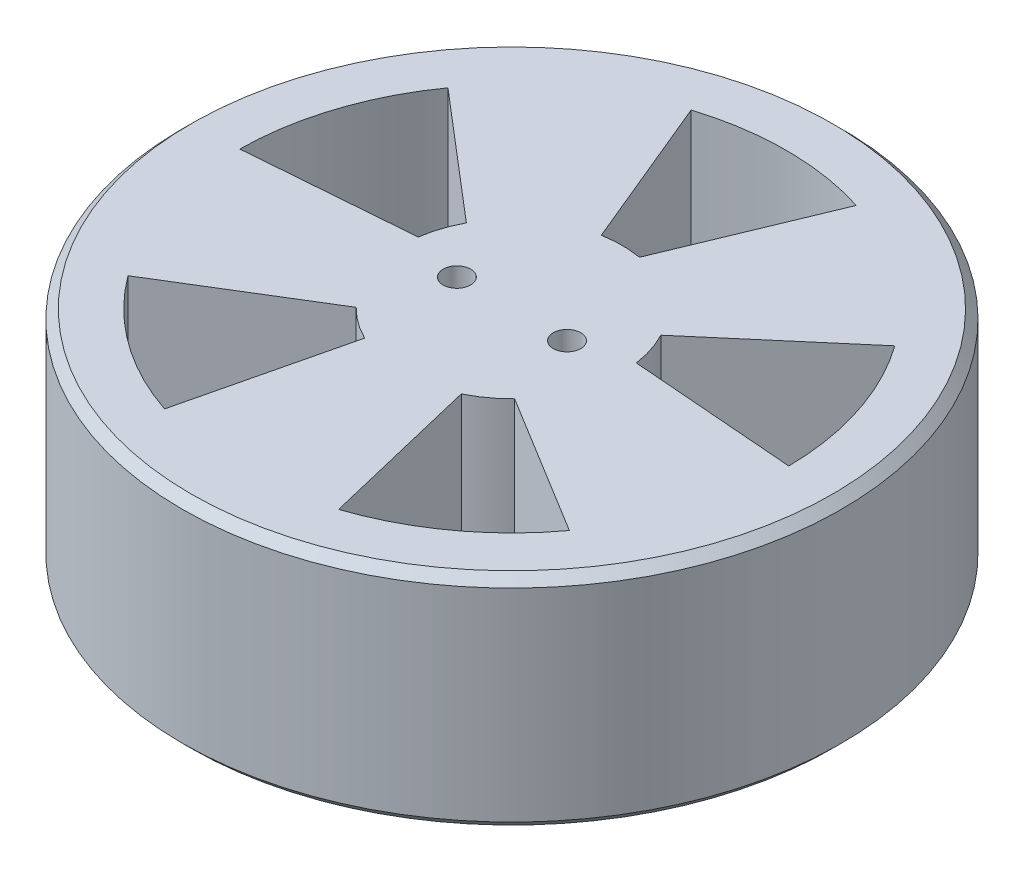
ISO-10303-21;
HEADER;
FILE_DESCRIPTION(('STEP AP214'),'2;1');
FILE_NAME('part.step','',(''),(''),'','','');
FILE_SCHEMA(('AUTOMOTIVE_DESIGN { 1 0 10303 214 1 1 1 1 }'));
ENDSEC;
DATA;
#1=APPLICATION_CONTEXT('core data for automotive mechanical design processes');
#2=APPLICATION_PROTOCOL_DEFINITION('international standard','automotive_design',2000,#1);
#3=PRODUCT_CONTEXT('',#1,'mechanical');
#4=PRODUCT('Part','Part','',(#3));
#5=PRODUCT_RELATED_PRODUCT_CATEGORY('part','',(#4));
#6=PRODUCT_DEFINITION_FORMATION('','',#4);
#7=PRODUCT_DEFINITION_CONTEXT('part definition',#1,'design');
#8=PRODUCT_DEFINITION('design','',#6,#7);
#9=PRODUCT_DEFINITION_SHAPE('','',#8);
#10=(LENGTH_UNIT() NAMED_UNIT(*) SI_UNIT(.MILLI.,.METRE.));
#11=(NAMED_UNIT(*) PLANE_ANGLE_UNIT() SI_UNIT($,.RADIAN.));
#12=(NAMED_UNIT(*) SI_UNIT($,.STERADIAN.) SOLID_ANGLE_UNIT());
#13=UNCERTAINTY_MEASURE_WITH_UNIT(LENGTH_MEASURE(1.E-05),#10,'distance_accuracy_value','');
#14=(GEOMETRIC_REPRESENTATION_CONTEXT(3) GLOBAL_UNCERTAINTY_ASSIGNED_CONTEXT((#13)) GLOBAL_UNIT_ASSIGNED_CONTEXT((#10,
#11,#12)) REPRESENTATION_CONTEXT('',''));
#15=CARTESIAN_POINT('',(0.,0.,0.));
#16=DIRECTION('',(0.,0.,1.));
#17=DIRECTION('',(1.,0.,0.));
#18=AXIS2_PLACEMENT_3D('',#15,#16,#17);
#19=CARTESIAN_POINT('',(0.,50.8,0.));
#20=DIRECTION('',(0.,-1.,0.));
#21=DIRECTION('',(0.,0.,-1.));
#22=AXIS2_PLACEMENT_3D('',#19,#20,#21);
#23=CYLINDRICAL_SURFACE('',#22,76.0095);
#24=CARTESIAN_POINT('',(0.,2.03200000000002,0.));
#25=DIRECTION('',(0.,1.,0.));
#26=DIRECTION('',(0.,0.,1.));
#27=AXIS2_PLACEMENT_3D('',#24,#25,#26);
#28=CIRCLE('',#27,76.0095);
#29=CARTESIAN_POINT('',(0.,2.03200000000002,76.0095));
#30=VERTEX_POINT('',#29);
#31=EDGE_CURVE('E210',#30,#30,#28,.T.);
#32=ORIENTED_EDGE('',*,*,#31,.T.);
#33=EDGE_LOOP('',(#32));
#34=FACE_BOUND('',#33,.T.);
#35=CARTESIAN_POINT('',(0.,48.768,0.));
#36=DIRECTION('',(0.,1.,0.));
#37=DIRECTION('',(0.,0.,1.));
#38=AXIS2_PLACEMENT_3D('',#35,#36,#37);
#39=CIRCLE('',#38,76.0095);
#40=CARTESIAN_POINT('',(0.,48.768,76.0095));
#41=VERTEX_POINT('',#40);
#42=EDGE_CURVE('E207',#41,#41,#39,.F.);
#43=ORIENTED_EDGE('',*,*,#42,.T.);
#44=EDGE_LOOP('',(#43));
#45=FACE_BOUND('',#44,.T.);
#46=ADVANCED_FACE('F41',(#34,#45),#23,.T.);
#47=CARTESIAN_POINT('',(0.,50.8,0.));
#48=DIRECTION('',(0.,1.,0.));
#49=DIRECTION('',(0.,0.,1.));
#50=AXIS2_PLACEMENT_3D('',#47,#48,#49);
#51=PLANE('',#50);
#52=CARTESIAN_POINT('',(0.,50.8,0.));
#53=DIRECTION('',(0.,1.,0.));
#54=DIRECTION('',(0.,0.,1.));
#55=AXIS2_PLACEMENT_3D('',#52,#53,#54);
#56=CIRCLE('',#55,25.4);
#57=CARTESIAN_POINT('',(-4.40340219489738,50.8,-25.0153962413145));
#58=VERTEX_POINT('',#57);
#59=CARTESIAN_POINT('',(4.40340219489736,50.8,-25.0153962413145));
#60=VERTEX_POINT('',#59);
#61=EDGE_CURVE('E46',#58,#60,#56,.F.);
#62=ORIENTED_EDGE('',*,*,#61,.F.);
#63=DIRECTION('',(0.38268343236509,0.,0.923879532511287));
#64=VECTOR('',#63,1.);
#65=CARTESIAN_POINT('',(-4.40340219489738,50.8,-25.0153962413145));
#66=LINE('',#65,#64);
#67=CARTESIAN_POINT('',(-19.05,50.8,-60.3754113050172));
#68=VERTEX_POINT('',#67);
#69=EDGE_CURVE('E88',#68,#58,#66,.T.);
#70=ORIENTED_EDGE('',*,*,#69,.F.);
#71=CARTESIAN_POINT('',(0.,50.8,0.));
#72=DIRECTION('',(0.,1.,0.));
#73=DIRECTION('',(0.,0.,1.));
#74=AXIS2_PLACEMENT_3D('',#71,#72,#73);
#75=CIRCLE('',#74,63.3095);
#76=CARTESIAN_POINT('',(19.05,50.8,-60.3754113050172));
#77=VERTEX_POINT('',#76);
#78=EDGE_CURVE('E184',#77,#68,#75,.T.);
#79=ORIENTED_EDGE('',*,*,#78,.F.);
#80=DIRECTION('',(0.382683432365091,0.,-0.923879532511286));
#81=VECTOR('',#80,1.);
#82=CARTESIAN_POINT('',(4.40340219489736,50.8,-25.0153962413145));
#83=LINE('',#82,#81);
#84=EDGE_CURVE('E182',#60,#77,#83,.T.);
#85=ORIENTED_EDGE('',*,*,#84,.F.);
#86=EDGE_LOOP('',(#62,#70,#79,#85));
#87=FACE_BOUND('',#86,.T.);
#88=CARTESIAN_POINT('',(0.,50.8,0.));
#89=DIRECTION('',(0.,1.,0.));
#90=DIRECTION('',(0.,0.,1.));
#91=AXIS2_PLACEMENT_3D('',#88,#89,#90);
#92=CIRCLE('',#91,25.4);
#93=CARTESIAN_POINT('',(18.2661081996371,50.8,17.6496258101738));
#94=VERTEX_POINT('',#93);
#95=CARTESIAN_POINT('',(11.1412537821572,50.8,22.8261355503197));
#96=VERTEX_POINT('',#95);
#97=EDGE_CURVE('E169',#94,#96,#92,.F.);
#98=ORIENTED_EDGE('',*,*,#97,.F.);
#99=DIRECTION('',(-0.85264016435409,0.,-0.522498564715953));
#100=VECTOR('',#99,1.);
#101=CARTESIAN_POINT('',(18.2661081996371,50.8,17.6496258101738));
#102=LINE('',#101,#100);
#103=CARTESIAN_POINT('',(50.8995501090239,50.8,37.6474247319649));
#104=VERTEX_POINT('',#103);
#105=EDGE_CURVE('E159',#104,#94,#102,.T.);
#106=ORIENTED_EDGE('',*,*,#105,.F.);
#107=CARTESIAN_POINT('',(0.,50.8,0.));
#108=DIRECTION('',(0.,1.,0.));
#109=DIRECTION('',(0.,0.,1.));
#110=AXIS2_PLACEMENT_3D('',#107,#108,#109);
#111=CIRCLE('',#110,63.3095);
#112=CARTESIAN_POINT('',(20.0760026233383,50.8,60.042042844308));
#113=VERTEX_POINT('',#112);
#114=EDGE_CURVE('E153',#113,#104,#111,.T.);
#115=ORIENTED_EDGE('',*,*,#114,.F.);
#116=DIRECTION('',(0.233445363855899,0.,0.972369920397678));
#117=VECTOR('',#116,1.);
#118=CARTESIAN_POINT('',(11.1412537821572,50.8,22.8261355503197));
#119=LINE('',#118,#117);
#120=EDGE_CURVE('E181',#96,#113,#119,.T.);
#121=ORIENTED_EDGE('',*,*,#120,.F.);
#122=EDGE_LOOP('',(#98,#106,#115,#121));
#123=FACE_BOUND('',#122,.T.);
#124=CARTESIAN_POINT('',(0.,50.8,0.));
#125=DIRECTION('',(0.,1.,0.));
#126=DIRECTION('',(0.,0.,1.));
#127=AXIS2_PLACEMENT_3D('',#124,#125,#126);
#128=CIRCLE('',#127,25.4);
#129=CARTESIAN_POINT('',(-11.1412537821575,50.8,22.8261355503195));
#130=VERTEX_POINT('',#129);
#131=CARTESIAN_POINT('',(-18.2661081996373,50.8,17.6496258101735));
#132=VERTEX_POINT('',#131);
#133=EDGE_CURVE('E240',#130,#132,#128,.F.);
#134=ORIENTED_EDGE('',*,*,#133,.F.);
#135=DIRECTION('',(0.233445363855913,0.,-0.972369920397675));
#136=VECTOR('',#135,1.);
#137=CARTESIAN_POINT('',(-11.1412537821575,50.8,22.8261355503195));
#138=LINE('',#137,#136);
#139=CARTESIAN_POINT('',(-20.0760026233392,50.8,60.0420428443077));
#140=VERTEX_POINT('',#139);
#141=EDGE_CURVE('E238',#140,#130,#138,.T.);
#142=ORIENTED_EDGE('',*,*,#141,.F.);
#143=CARTESIAN_POINT('',(0.,50.8,0.));
#144=DIRECTION('',(0.,1.,0.));
#145=DIRECTION('',(0.,0.,1.));
#146=AXIS2_PLACEMENT_3D('',#143,#144,#145);
#147=CIRCLE('',#146,63.3095);
#148=CARTESIAN_POINT('',(-50.8995501090245,50.8,37.6474247319642));
#149=VERTEX_POINT('',#148);
#150=EDGE_CURVE('E236',#149,#140,#147,.T.);
#151=ORIENTED_EDGE('',*,*,#150,.F.);
#152=DIRECTION('',(-0.852640164354098,0.,0.522498564715941));
#153=VECTOR('',#152,1.);
#154=CARTESIAN_POINT('',(-18.2661081996373,50.8,17.6496258101735));
#155=LINE('',#154,#153);
#156=EDGE_CURVE('E234',#132,#149,#155,.T.);
#157=ORIENTED_EDGE('',*,*,#156,.F.);
#158=EDGE_LOOP('',(#134,#142,#151,#157));
#159=FACE_BOUND('',#158,.T.);
#160=CARTESIAN_POINT('',(0.,50.8,0.));
#161=DIRECTION('',(0.,1.,0.));
#162=DIRECTION('',(0.,0.,1.));
#163=AXIS2_PLACEMENT_3D('',#160,#161,#162);
#164=CIRCLE('',#163,25.4);
#165=CARTESIAN_POINT('',(-25.1517817142987,50.8,-3.54229820826412));
#166=VERTEX_POINT('',#165);
#167=CARTESIAN_POINT('',(-22.4303294917161,50.8,-11.9180669109151));
#168=VERTEX_POINT('',#167);
#169=EDGE_CURVE('E231',#166,#168,#164,.F.);
#170=ORIENTED_EDGE('',*,*,#169,.F.);
#171=DIRECTION('',(0.996917333733129,0.,-0.0784590957278343));
#172=VECTOR('',#171,1.);
#173=CARTESIAN_POINT('',(-25.1517817142987,50.8,-3.54229820826412));
#174=LINE('',#173,#172);
#175=CARTESIAN_POINT('',(-63.3072020884795,50.8,-0.539401500205684));
#176=VERTEX_POINT('',#175);
#177=EDGE_CURVE('E229',#176,#166,#174,.T.);
#178=ORIENTED_EDGE('',*,*,#177,.F.);
#179=CARTESIAN_POINT('',(0.,50.8,0.));
#180=DIRECTION('',(0.,1.,0.));
#181=DIRECTION('',(0.,0.,1.));
#182=AXIS2_PLACEMENT_3D('',#179,#180,#181);
#183=CIRCLE('',#182,63.3095);
#184=CARTESIAN_POINT('',(-51.5336546027935,50.8,-36.7746547710509));
#185=VERTEX_POINT('',#184);
#186=EDGE_CURVE('E227',#185,#176,#183,.T.);
#187=ORIENTED_EDGE('',*,*,#186,.F.);
#188=DIRECTION('',(-0.760405965600023,0.,-0.649448048330193));
#189=VECTOR('',#188,1.);
#190=CARTESIAN_POINT('',(-22.4303294917161,50.8,-11.9180669109151));
#191=LINE('',#190,#189);
#192=EDGE_CURVE('E225',#168,#185,#191,.T.);
#193=ORIENTED_EDGE('',*,*,#192,.F.);
#194=EDGE_LOOP('',(#170,#178,#187,#193));
#195=FACE_BOUND('',#194,.T.);
#196=CARTESIAN_POINT('',(0.,50.8,0.));
#197=DIRECTION('',(0.,1.,0.));
#198=DIRECTION('',(0.,0.,1.));
#199=AXIS2_PLACEMENT_3D('',#196,#197,#198);
#200=CIRCLE('',#199,25.4);
#201=CARTESIAN_POINT('',(22.4303294917163,50.8,-11.9180669109148));
#202=VERTEX_POINT('',#201);
#203=CARTESIAN_POINT('',(25.1517817142987,50.8,-3.54229820826378));
#204=VERTEX_POINT('',#203);
#205=EDGE_CURVE('E222',#202,#204,#200,.F.);
#206=ORIENTED_EDGE('',*,*,#205,.F.);
#207=DIRECTION('',(-0.760405965600033,0.,0.649448048330182));
#208=VECTOR('',#207,1.);
#209=CARTESIAN_POINT('',(22.4303294917163,50.8,-11.9180669109148));
#210=LINE('',#209,#208);
#211=CARTESIAN_POINT('',(51.5336546027941,50.8,-36.7746547710502));
#212=VERTEX_POINT('',#211);
#213=EDGE_CURVE('E220',#212,#202,#210,.T.);
#214=ORIENTED_EDGE('',*,*,#213,.F.);
#215=CARTESIAN_POINT('',(0.,50.8,0.));
#216=DIRECTION('',(0.,1.,0.));
#217=DIRECTION('',(0.,0.,1.));
#218=AXIS2_PLACEMENT_3D('',#215,#216,#217);
#219=CIRCLE('',#218,63.3095);
#220=CARTESIAN_POINT('',(63.3072020884795,50.8,-0.539401500204789));
#221=VERTEX_POINT('',#220);
#222=EDGE_CURVE('E217',#221,#212,#219,.T.);
#223=ORIENTED_EDGE('',*,*,#222,.F.);
#224=DIRECTION('',(0.996917333733128,0.,0.0784590957278488));
#225=VECTOR('',#224,1.);
#226=CARTESIAN_POINT('',(25.1517817142987,50.8,-3.54229820826378));
#227=LINE('',#226,#225);
#228=EDGE_CURVE('E215',#204,#221,#227,.T.);
#229=ORIENTED_EDGE('',*,*,#228,.F.);
#230=EDGE_LOOP('',(#206,#214,#223,#229));
#231=FACE_BOUND('',#230,.T.);
#232=CARTESIAN_POINT('',(-12.7,50.8,0.));
#233=DIRECTION('',(0.,1.,0.));
#234=DIRECTION('',(0.,0.,1.));
#235=AXIS2_PLACEMENT_3D('',#232,#233,#234);
#236=CIRCLE('',#235,3.175);
#237=CARTESIAN_POINT('',(-12.7,50.8,3.175));
#238=VERTEX_POINT('',#237);
#239=EDGE_CURVE('E204',#238,#238,#236,.T.);
#240=ORIENTED_EDGE('',*,*,#239,.F.);
#241=EDGE_LOOP('',(#240));
#242=FACE_BOUND('',#241,.T.);
#243=CARTESIAN_POINT('',(12.7,50.8,0.));
#244=DIRECTION('',(0.,1.,0.));
#245=DIRECTION('',(0.,0.,1.));
#246=AXIS2_PLACEMENT_3D('',#243,#244,#245);
#247=CIRCLE('',#246,3.175);
#248=CARTESIAN_POINT('',(12.7,50.8,3.175));
#249=VERTEX_POINT('',#248);
#250=EDGE_CURVE('E198',#249,#249,#247,.T.);
#251=ORIENTED_EDGE('',*,*,#250,.F.);
#252=EDGE_LOOP('',(#251));
#253=FACE_BOUND('',#252,.T.);
#254=CARTESIAN_POINT('',(0.,50.8,0.));
#255=DIRECTION('',(0.,1.,0.));
#256=DIRECTION('',(0.,0.,1.));
#257=AXIS2_PLACEMENT_3D('',#254,#255,#256);
#258=CIRCLE('',#257,73.9775000000001);
#259=CARTESIAN_POINT('',(0.,50.8,73.9775000000001));
#260=VERTEX_POINT('',#259);
#261=EDGE_CURVE('E11',#260,#260,#258,.T.);
#262=ORIENTED_EDGE('',*,*,#261,.T.);
#263=EDGE_LOOP('',(#262));
#264=FACE_BOUND('',#263,.T.);
#265=ADVANCED_FACE('F179',(#87,#123,#159,#195,#231,#242,#253,#264),#51,.T.);
#266=CARTESIAN_POINT('',(0.,0.,0.));
#267=DIRECTION('',(0.,1.,0.));
#268=DIRECTION('',(0.,0.,1.));
#269=AXIS2_PLACEMENT_3D('',#266,#267,#268);
#270=PLANE('',#269);
#271=DIRECTION('',(0.38268343236509,0.,0.923879532511286));
#272=VECTOR('',#271,1.);
#273=CARTESIAN_POINT('',(-4.40340219489738,0.,-25.0153962413145));
#274=LINE('',#273,#272);
#275=CARTESIAN_POINT('',(-19.05,0.,-60.3754113050172));
#276=VERTEX_POINT('',#275);
#277=CARTESIAN_POINT('',(-4.40340219489738,0.,-25.0153962413145));
#278=VERTEX_POINT('',#277);
#279=EDGE_CURVE('E394',#276,#278,#274,.T.);
#280=ORIENTED_EDGE('',*,*,#279,.T.);
#281=CARTESIAN_POINT('',(0.,0.,0.));
#282=DIRECTION('',(0.,-1.,0.));
#283=DIRECTION('',(0.,0.,1.));
#284=AXIS2_PLACEMENT_3D('',#281,#282,#283);
#285=CIRCLE('',#284,25.4);
#286=CARTESIAN_POINT('',(4.40340219489736,0.,-25.0153962413145));
#287=VERTEX_POINT('',#286);
#288=EDGE_CURVE('E255',#278,#287,#285,.T.);
#289=ORIENTED_EDGE('',*,*,#288,.T.);
#290=DIRECTION('',(0.382683432365091,0.,-0.923879532511287));
#291=VECTOR('',#290,1.);
#292=CARTESIAN_POINT('',(4.40340219489736,0.,-25.0153962413145));
#293=LINE('',#292,#291);
#294=CARTESIAN_POINT('',(19.05,0.,-60.3754113050172));
#295=VERTEX_POINT('',#294);
#296=EDGE_CURVE('E401',#287,#295,#293,.T.);
#297=ORIENTED_EDGE('',*,*,#296,.T.);
#298=CARTESIAN_POINT('',(0.,0.,0.));
#299=DIRECTION('',(0.,1.,0.));
#300=DIRECTION('',(0.,0.,1.));
#301=AXIS2_PLACEMENT_3D('',#298,#299,#300);
#302=CIRCLE('',#301,63.3095);
#303=EDGE_CURVE('E399',#295,#276,#302,.T.);
#304=ORIENTED_EDGE('',*,*,#303,.T.);
#305=EDGE_LOOP('',(#280,#289,#297,#304));
#306=FACE_BOUND('',#305,.T.);
#307=DIRECTION('',(-0.85264016435409,0.,-0.522498564715953));
#308=VECTOR('',#307,1.);
#309=CARTESIAN_POINT('',(18.2661081996371,0.,17.6496258101738));
#310=LINE('',#309,#308);
#311=CARTESIAN_POINT('',(50.8995501090239,0.,37.6474247319649));
#312=VERTEX_POINT('',#311);
#313=CARTESIAN_POINT('',(18.2661081996371,0.,17.6496258101738));
#314=VERTEX_POINT('',#313);
#315=EDGE_CURVE('E251',#312,#314,#310,.T.);
#316=ORIENTED_EDGE('',*,*,#315,.T.);
#317=CARTESIAN_POINT('',(0.,0.,0.));
#318=DIRECTION('',(0.,-1.,0.));
#319=DIRECTION('',(0.,0.,1.));
#320=AXIS2_PLACEMENT_3D('',#317,#318,#319);
#321=CIRCLE('',#320,25.4);
#322=CARTESIAN_POINT('',(11.1412537821572,0.,22.8261355503197));
#323=VERTEX_POINT('',#322);
#324=EDGE_CURVE('E175',#314,#323,#321,.T.);
#325=ORIENTED_EDGE('',*,*,#324,.T.);
#326=DIRECTION('',(0.233445363855899,0.,0.972369920397678));
#327=VECTOR('',#326,1.);
#328=CARTESIAN_POINT('',(11.1412537821572,0.,22.8261355503197));
#329=LINE('',#328,#327);
#330=CARTESIAN_POINT('',(20.0760026233383,0.,60.042042844308));
#331=VERTEX_POINT('',#330);
#332=EDGE_CURVE('E260',#323,#331,#329,.T.);
#333=ORIENTED_EDGE('',*,*,#332,.T.);
#334=CARTESIAN_POINT('',(0.,0.,0.));
#335=DIRECTION('',(0.,1.,0.));
#336=DIRECTION('',(0.,0.,1.));
#337=AXIS2_PLACEMENT_3D('',#334,#335,#336);
#338=CIRCLE('',#337,63.3095);
#339=EDGE_CURVE('E249',#331,#312,#338,.T.);
#340=ORIENTED_EDGE('',*,*,#339,.T.);
#341=EDGE_LOOP('',(#316,#325,#333,#340));
#342=FACE_BOUND('',#341,.T.);
#343=DIRECTION('',(0.233445363855913,0.,-0.972369920397675));
#344=VECTOR('',#343,1.);
#345=CARTESIAN_POINT('',(-11.1412537821575,0.,22.8261355503195));
#346=LINE('',#345,#344);
#347=CARTESIAN_POINT('',(-20.0760026233392,0.,60.0420428443077));
#348=VERTEX_POINT('',#347);
#349=CARTESIAN_POINT('',(-11.1412537821575,0.,22.8261355503195));
#350=VERTEX_POINT('',#349);
#351=EDGE_CURVE('E342',#348,#350,#346,.T.);
#352=ORIENTED_EDGE('',*,*,#351,.T.);
#353=CARTESIAN_POINT('',(0.,0.,0.));
#354=DIRECTION('',(0.,-1.,0.));
#355=DIRECTION('',(0.,0.,1.));
#356=AXIS2_PLACEMENT_3D('',#353,#354,#355);
#357=CIRCLE('',#356,25.4);
#358=CARTESIAN_POINT('',(-18.2661081996373,0.,17.6496258101735));
#359=VERTEX_POINT('',#358);
#360=EDGE_CURVE('E177',#350,#359,#357,.T.);
#361=ORIENTED_EDGE('',*,*,#360,.T.);
#362=DIRECTION('',(-0.852640164354098,0.,0.522498564715941));
#363=VECTOR('',#362,1.);
#364=CARTESIAN_POINT('',(-18.2661081996373,0.,17.6496258101735));
#365=LINE('',#364,#363);
#366=CARTESIAN_POINT('',(-50.8995501090245,0.,37.6474247319642));
#367=VERTEX_POINT('',#366);
#368=EDGE_CURVE('E356',#359,#367,#365,.T.);
#369=ORIENTED_EDGE('',*,*,#368,.T.);
#370=CARTESIAN_POINT('',(0.,0.,0.));
#371=DIRECTION('',(0.,1.,0.));
#372=DIRECTION('',(0.,0.,1.));
#373=AXIS2_PLACEMENT_3D('',#370,#371,#372);
#374=CIRCLE('',#373,63.3095);
#375=EDGE_CURVE('E359',#367,#348,#374,.T.);
#376=ORIENTED_EDGE('',*,*,#375,.T.);
#377=EDGE_LOOP('',(#352,#361,#369,#376));
#378=FACE_BOUND('',#377,.T.);
#379=DIRECTION('',(0.996917333733129,0.,-0.0784590957278343));
#380=VECTOR('',#379,1.);
#381=CARTESIAN_POINT('',(-25.1517817142987,0.,-3.54229820826412));
#382=LINE('',#381,#380);
#383=CARTESIAN_POINT('',(-63.3072020884795,0.,-0.539401500205684));
#384=VERTEX_POINT('',#383);
#385=CARTESIAN_POINT('',(-25.1517817142987,0.,-3.54229820826412));
#386=VERTEX_POINT('',#385);
#387=EDGE_CURVE('E373',#384,#386,#382,.T.);
#388=ORIENTED_EDGE('',*,*,#387,.T.);
#389=CARTESIAN_POINT('',(0.,0.,0.));
#390=DIRECTION('',(0.,-1.,0.));
#391=DIRECTION('',(0.,0.,1.));
#392=AXIS2_PLACEMENT_3D('',#389,#390,#391);
#393=CIRCLE('',#392,25.4);
#394=CARTESIAN_POINT('',(-22.4303294917161,0.,-11.9180669109151));
#395=VERTEX_POINT('',#394);
#396=EDGE_CURVE('E348',#386,#395,#393,.T.);
#397=ORIENTED_EDGE('',*,*,#396,.T.);
#398=DIRECTION('',(-0.760405965600023,0.,-0.649448048330193));
#399=VECTOR('',#398,1.);
#400=CARTESIAN_POINT('',(-22.4303294917161,0.,-11.9180669109151));
#401=LINE('',#400,#399);
#402=CARTESIAN_POINT('',(-51.5336546027936,0.,-36.7746547710509));
#403=VERTEX_POINT('',#402);
#404=EDGE_CURVE('E384',#395,#403,#401,.T.);
#405=ORIENTED_EDGE('',*,*,#404,.T.);
#406=CARTESIAN_POINT('',(0.,0.,0.));
#407=DIRECTION('',(0.,1.,0.));
#408=DIRECTION('',(0.,0.,1.));
#409=AXIS2_PLACEMENT_3D('',#406,#407,#408);
#410=CIRCLE('',#409,63.3095);
#411=EDGE_CURVE('E381',#403,#384,#410,.T.);
#412=ORIENTED_EDGE('',*,*,#411,.T.);
#413=EDGE_LOOP('',(#388,#397,#405,#412));
#414=FACE_BOUND('',#413,.T.);
#415=DIRECTION('',(-0.760405965600032,0.,0.649448048330182));
#416=VECTOR('',#415,1.);
#417=CARTESIAN_POINT('',(22.4303294917163,0.,-11.9180669109148));
#418=LINE('',#417,#416);
#419=CARTESIAN_POINT('',(51.5336546027941,0.,-36.7746547710502));
#420=VERTEX_POINT('',#419);
#421=CARTESIAN_POINT('',(22.4303294917163,0.,-11.9180669109148));
#422=VERTEX_POINT('',#421);
#423=EDGE_CURVE('E271',#420,#422,#418,.T.);
#424=ORIENTED_EDGE('',*,*,#423,.T.);
#425=CARTESIAN_POINT('',(0.,0.,0.));
#426=DIRECTION('',(0.,-1.,0.));
#427=DIRECTION('',(0.,0.,1.));
#428=AXIS2_PLACEMENT_3D('',#425,#426,#427);
#429=CIRCLE('',#428,25.4);
#430=CARTESIAN_POINT('',(25.1517817142987,0.,-3.54229820826378));
#431=VERTEX_POINT('',#430);
#432=EDGE_CURVE('E264',#422,#431,#429,.T.);
#433=ORIENTED_EDGE('',*,*,#432,.T.);
#434=DIRECTION('',(0.996917333733128,0.,0.0784590957278488));
#435=VECTOR('',#434,1.);
#436=CARTESIAN_POINT('',(25.1517817142987,0.,-3.54229820826378));
#437=LINE('',#436,#435);
#438=CARTESIAN_POINT('',(63.3072020884795,0.,-0.539401500204789));
#439=VERTEX_POINT('',#438);
#440=EDGE_CURVE('E267',#431,#439,#437,.T.);
#441=ORIENTED_EDGE('',*,*,#440,.T.);
#442=CARTESIAN_POINT('',(0.,0.,0.));
#443=DIRECTION('',(0.,1.,0.));
#444=DIRECTION('',(0.,0.,1.));
#445=AXIS2_PLACEMENT_3D('',#442,#443,#444);
#446=CIRCLE('',#445,63.3095);
#447=EDGE_CURVE('E97',#439,#420,#446,.T.);
#448=ORIENTED_EDGE('',*,*,#447,.T.);
#449=EDGE_LOOP('',(#424,#433,#441,#448));
#450=FACE_BOUND('',#449,.T.);
#451=CARTESIAN_POINT('',(-12.7,0.,0.));
#452=DIRECTION('',(0.,1.,0.));
#453=DIRECTION('',(0.,0.,1.));
#454=AXIS2_PLACEMENT_3D('',#451,#452,#453);
#455=CIRCLE('',#454,3.175);
#456=CARTESIAN_POINT('',(-12.7,0.,3.175));
#457=VERTEX_POINT('',#456);
#458=EDGE_CURVE('E193',#457,#457,#455,.T.);
#459=ORIENTED_EDGE('',*,*,#458,.T.);
#460=EDGE_LOOP('',(#459));
#461=FACE_BOUND('',#460,.T.);
#462=CARTESIAN_POINT('',(12.7,0.,0.));
#463=DIRECTION('',(0.,1.,0.));
#464=DIRECTION('',(0.,0.,1.));
#465=AXIS2_PLACEMENT_3D('',#462,#463,#464);
#466=CIRCLE('',#465,3.175);
#467=CARTESIAN_POINT('',(12.7,0.,3.175));
#468=VERTEX_POINT('',#467);
#469=EDGE_CURVE('E188',#468,#468,#466,.T.);
#470=ORIENTED_EDGE('',*,*,#469,.T.);
#471=EDGE_LOOP('',(#470));
#472=FACE_BOUND('',#471,.T.);
#473=CARTESIAN_POINT('',(0.,0.,0.));
#474=DIRECTION('',(0.,1.,0.));
#475=DIRECTION('',(0.,0.,1.));
#476=AXIS2_PLACEMENT_3D('',#473,#474,#475);
#477=CIRCLE('',#476,73.9775);
#478=CARTESIAN_POINT('',(0.,0.,73.9775));
#479=VERTEX_POINT('',#478);
#480=EDGE_CURVE('E51',#479,#479,#477,.F.);
#481=ORIENTED_EDGE('',*,*,#480,.T.);
#482=EDGE_LOOP('',(#481));
#483=FACE_BOUND('',#482,.T.);
#484=ADVANCED_FACE('F301',(#306,#342,#378,#414,#450,#461,#472,#483),#270,.F.);
#485=CARTESIAN_POINT('',(0.,2.03200000000002,0.));
#486=DIRECTION('',(0.,1.,0.));
#487=DIRECTION('',(0.,0.,1.));
#488=AXIS2_PLACEMENT_3D('',#485,#486,#487);
#489=CONICAL_SURFACE('',#488,76.0095,0.785398163397445);
#490=ORIENTED_EDGE('',*,*,#480,.F.);
#491=EDGE_LOOP('',(#490));
#492=FACE_BOUND('',#491,.T.);
#493=ORIENTED_EDGE('',*,*,#31,.F.);
#494=EDGE_LOOP('',(#493));
#495=FACE_BOUND('',#494,.T.);
#496=ADVANCED_FACE('F421',(#492,#495),#489,.T.);
#497=CARTESIAN_POINT('',(0.,50.8,0.));
#498=DIRECTION('',(0.,-1.,0.));
#499=DIRECTION('',(0.,0.,-1.));
#500=AXIS2_PLACEMENT_3D('',#497,#498,#499);
#501=CONICAL_SURFACE('',#500,73.9775000000001,0.785398163397438);
#502=ORIENTED_EDGE('',*,*,#42,.F.);
#503=EDGE_LOOP('',(#502));
#504=FACE_BOUND('',#503,.T.);
#505=ORIENTED_EDGE('',*,*,#261,.F.);
#506=EDGE_LOOP('',(#505));
#507=FACE_BOUND('',#506,.T.);
#508=ADVANCED_FACE('F44',(#504,#507),#501,.T.);
#509=CARTESIAN_POINT('',(12.7,0.,0.));
#510=DIRECTION('',(0.,1.,0.));
#511=DIRECTION('',(0.,0.,1.));
#512=AXIS2_PLACEMENT_3D('',#509,#510,#511);
#513=CYLINDRICAL_SURFACE('',#512,3.175);
#514=ORIENTED_EDGE('',*,*,#250,.T.);
#515=EDGE_LOOP('',(#514));
#516=FACE_BOUND('',#515,.T.);
#517=ORIENTED_EDGE('',*,*,#469,.F.);
#518=EDGE_LOOP('',(#517));
#519=FACE_BOUND('',#518,.T.);
#520=ADVANCED_FACE('F427',(#516,#519),#513,.F.);
#521=CARTESIAN_POINT('',(-12.7,0.,0.));
#522=DIRECTION('',(0.,1.,0.));
#523=DIRECTION('',(0.,0.,1.));
#524=AXIS2_PLACEMENT_3D('',#521,#522,#523);
#525=CYLINDRICAL_SURFACE('',#524,3.175);
#526=ORIENTED_EDGE('',*,*,#239,.T.);
#527=EDGE_LOOP('',(#526));
#528=FACE_BOUND('',#527,.T.);
#529=ORIENTED_EDGE('',*,*,#458,.F.);
#530=EDGE_LOOP('',(#529));
#531=FACE_BOUND('',#530,.T.);
#532=ADVANCED_FACE('F450',(#528,#531),#525,.F.);
#533=CARTESIAN_POINT('',(0.,0.,0.));
#534=DIRECTION('',(0.,1.,0.));
#535=DIRECTION('',(0.,0.,1.));
#536=AXIS2_PLACEMENT_3D('',#533,#534,#535);
#537=CYLINDRICAL_SURFACE('',#536,25.4);
#538=ORIENTED_EDGE('',*,*,#205,.T.);
#539=DIRECTION('',(0.,1.,0.));
#540=VECTOR('',#539,1.);
#541=CARTESIAN_POINT('',(25.1517817142987,0.,-3.54229820826378));
#542=LINE('',#541,#540);
#543=EDGE_CURVE('E274',#431,#204,#542,.T.);
#544=ORIENTED_EDGE('',*,*,#543,.F.);
#545=ORIENTED_EDGE('',*,*,#432,.F.);
#546=DIRECTION('',(0.,1.,0.));
#547=VECTOR('',#546,1.);
#548=CARTESIAN_POINT('',(22.4303294917163,0.,-11.9180669109148));
#549=LINE('',#548,#547);
#550=EDGE_CURVE('E218',#422,#202,#549,.T.);
#551=ORIENTED_EDGE('',*,*,#550,.T.);
#552=EDGE_LOOP('',(#538,#544,#545,#551));
#553=FACE_BOUND('',#552,.T.);
#554=ADVANCED_FACE('F296',(#553),#537,.T.);
#555=CARTESIAN_POINT('',(22.4303294917163,0.,-11.9180669109148));
#556=DIRECTION('',(-0.649448048330182,0.,-0.760405965600032));
#557=DIRECTION('',(-0.760405965600033,0.,0.649448048330182));
#558=AXIS2_PLACEMENT_3D('',#555,#556,#557);
#559=PLANE('',#558);
#560=ORIENTED_EDGE('',*,*,#213,.T.);
#561=ORIENTED_EDGE('',*,*,#550,.F.);
#562=ORIENTED_EDGE('',*,*,#423,.F.);
#563=DIRECTION('',(0.,1.,0.));
#564=VECTOR('',#563,1.);
#565=CARTESIAN_POINT('',(51.5336546027941,0.,-36.7746547710502));
#566=LINE('',#565,#564);
#567=EDGE_CURVE('E275',#420,#212,#566,.T.);
#568=ORIENTED_EDGE('',*,*,#567,.T.);
#569=EDGE_LOOP('',(#560,#561,#562,#568));
#570=FACE_BOUND('',#569,.T.);
#571=ADVANCED_FACE('F292',(#570),#559,.F.);
#572=CARTESIAN_POINT('',(0.,0.,0.));
#573=DIRECTION('',(0.,1.,0.));
#574=DIRECTION('',(0.,0.,1.));
#575=AXIS2_PLACEMENT_3D('',#572,#573,#574);
#576=CYLINDRICAL_SURFACE('',#575,63.3095);
#577=ORIENTED_EDGE('',*,*,#222,.T.);
#578=ORIENTED_EDGE('',*,*,#567,.F.);
#579=ORIENTED_EDGE('',*,*,#447,.F.);
#580=DIRECTION('',(0.,1.,0.));
#581=VECTOR('',#580,1.);
#582=CARTESIAN_POINT('',(63.3072020884795,0.,-0.539401500204788));
#583=LINE('',#582,#581);
#584=EDGE_CURVE('E278',#439,#221,#583,.T.);
#585=ORIENTED_EDGE('',*,*,#584,.T.);
#586=EDGE_LOOP('',(#577,#578,#579,#585));
#587=FACE_BOUND('',#586,.T.);
#588=ADVANCED_FACE('F282',(#587),#576,.F.);
#589=CARTESIAN_POINT('',(25.1517817142987,0.,-3.54229820826378));
#590=DIRECTION('',(-0.0784590957278488,0.,0.996917333733128));
#591=DIRECTION('',(0.996917333733128,0.,0.0784590957278488));
#592=AXIS2_PLACEMENT_3D('',#589,#590,#591);
#593=PLANE('',#592);
#594=ORIENTED_EDGE('',*,*,#228,.T.);
#595=ORIENTED_EDGE('',*,*,#584,.F.);
#596=ORIENTED_EDGE('',*,*,#440,.F.);
#597=ORIENTED_EDGE('',*,*,#543,.T.);
#598=EDGE_LOOP('',(#594,#595,#596,#597));
#599=FACE_BOUND('',#598,.T.);
#600=ADVANCED_FACE('F464',(#599),#593,.F.);
#601=CARTESIAN_POINT('',(0.,0.,0.));
#602=DIRECTION('',(0.,1.,0.));
#603=DIRECTION('',(0.,0.,1.));
#604=AXIS2_PLACEMENT_3D('',#601,#602,#603);
#605=CYLINDRICAL_SURFACE('',#604,25.4);
#606=ORIENTED_EDGE('',*,*,#169,.T.);
#607=DIRECTION('',(0.,1.,0.));
#608=VECTOR('',#607,1.);
#609=CARTESIAN_POINT('',(-22.4303294917161,0.,-11.9180669109151));
#610=LINE('',#609,#608);
#611=EDGE_CURVE('E370',#395,#168,#610,.T.);
#612=ORIENTED_EDGE('',*,*,#611,.F.);
#613=ORIENTED_EDGE('',*,*,#396,.F.);
#614=DIRECTION('',(0.,1.,0.));
#615=VECTOR('',#614,1.);
#616=CARTESIAN_POINT('',(-25.1517817142987,0.,-3.54229820826412));
#617=LINE('',#616,#615);
#618=EDGE_CURVE('E374',#386,#166,#617,.T.);
#619=ORIENTED_EDGE('',*,*,#618,.T.);
#620=EDGE_LOOP('',(#606,#612,#613,#619));
#621=FACE_BOUND('',#620,.T.);
#622=ADVANCED_FACE('F467',(#621),#605,.T.);
#623=CARTESIAN_POINT('',(-25.1517817142987,0.,-3.54229820826412));
#624=DIRECTION('',(0.0784590957278343,0.,0.996917333733129));
#625=DIRECTION('',(0.996917333733129,0.,-0.0784590957278343));
#626=AXIS2_PLACEMENT_3D('',#623,#624,#625);
#627=PLANE('',#626);
#628=ORIENTED_EDGE('',*,*,#177,.T.);
#629=ORIENTED_EDGE('',*,*,#618,.F.);
#630=ORIENTED_EDGE('',*,*,#387,.F.);
#631=DIRECTION('',(0.,1.,0.));
#632=VECTOR('',#631,1.);
#633=CARTESIAN_POINT('',(-63.3072020884795,0.,-0.539401500205684));
#634=LINE('',#633,#632);
#635=EDGE_CURVE('E371',#384,#176,#634,.T.);
#636=ORIENTED_EDGE('',*,*,#635,.T.);
#637=EDGE_LOOP('',(#628,#629,#630,#636));
#638=FACE_BOUND('',#637,.T.);
#639=ADVANCED_FACE('F490',(#638),#627,.F.);
#640=CARTESIAN_POINT('',(0.,0.,0.));
#641=DIRECTION('',(0.,1.,0.));
#642=DIRECTION('',(0.,0.,1.));
#643=AXIS2_PLACEMENT_3D('',#640,#641,#642);
#644=CYLINDRICAL_SURFACE('',#643,63.3095);
#645=ORIENTED_EDGE('',*,*,#186,.T.);
#646=ORIENTED_EDGE('',*,*,#635,.F.);
#647=ORIENTED_EDGE('',*,*,#411,.F.);
#648=DIRECTION('',(0.,1.,0.));
#649=VECTOR('',#648,1.);
#650=CARTESIAN_POINT('',(-51.5336546027935,0.,-36.7746547710509));
#651=LINE('',#650,#649);
#652=EDGE_CURVE('E367',#403,#185,#651,.T.);
#653=ORIENTED_EDGE('',*,*,#652,.T.);
#654=EDGE_LOOP('',(#645,#646,#647,#653));
#655=FACE_BOUND('',#654,.T.);
#656=ADVANCED_FACE('F493',(#655),#644,.F.);
#657=CARTESIAN_POINT('',(-22.4303294917161,0.,-11.9180669109151));
#658=DIRECTION('',(0.649448048330193,0.,-0.760405965600023));
#659=DIRECTION('',(-0.760405965600023,0.,-0.649448048330193));
#660=AXIS2_PLACEMENT_3D('',#657,#658,#659);
#661=PLANE('',#660);
#662=ORIENTED_EDGE('',*,*,#192,.T.);
#663=ORIENTED_EDGE('',*,*,#652,.F.);
#664=ORIENTED_EDGE('',*,*,#404,.F.);
#665=ORIENTED_EDGE('',*,*,#611,.T.);
#666=EDGE_LOOP('',(#662,#663,#664,#665));
#667=FACE_BOUND('',#666,.T.);
#668=ADVANCED_FACE('F497',(#667),#661,.F.);
#669=CARTESIAN_POINT('',(0.,0.,0.));
#670=DIRECTION('',(0.,1.,0.));
#671=DIRECTION('',(0.,0.,1.));
#672=AXIS2_PLACEMENT_3D('',#669,#670,#671);
#673=CYLINDRICAL_SURFACE('',#672,25.4);
#674=ORIENTED_EDGE('',*,*,#133,.T.);
#675=DIRECTION('',(0.,1.,0.));
#676=VECTOR('',#675,1.);
#677=CARTESIAN_POINT('',(-18.2661081996373,0.,17.6496258101735));
#678=LINE('',#677,#676);
#679=EDGE_CURVE('E352',#359,#132,#678,.T.);
#680=ORIENTED_EDGE('',*,*,#679,.F.);
#681=ORIENTED_EDGE('',*,*,#360,.F.);
#682=DIRECTION('',(0.,1.,0.));
#683=VECTOR('',#682,1.);
#684=CARTESIAN_POINT('',(-11.1412537821575,0.,22.8261355503195));
#685=LINE('',#684,#683);
#686=EDGE_CURVE('E337',#350,#130,#685,.T.);
#687=ORIENTED_EDGE('',*,*,#686,.T.);
#688=EDGE_LOOP('',(#674,#680,#681,#687));
#689=FACE_BOUND('',#688,.T.);
#690=ADVANCED_FACE('F351',(#689),#673,.T.);
#691=CARTESIAN_POINT('',(-11.1412537821575,0.,22.8261355503195));
#692=DIRECTION('',(0.972369920397675,0.,0.233445363855913));
#693=DIRECTION('',(0.233445363855913,0.,-0.972369920397675));
#694=AXIS2_PLACEMENT_3D('',#691,#692,#693);
#695=PLANE('',#694);
#696=ORIENTED_EDGE('',*,*,#141,.T.);
#697=ORIENTED_EDGE('',*,*,#686,.F.);
#698=ORIENTED_EDGE('',*,*,#351,.F.);
#699=DIRECTION('',(0.,1.,0.));
#700=VECTOR('',#699,1.);
#701=CARTESIAN_POINT('',(-20.0760026233392,0.,60.0420428443077));
#702=LINE('',#701,#700);
#703=EDGE_CURVE('E347',#348,#140,#702,.T.);
#704=ORIENTED_EDGE('',*,*,#703,.T.);
#705=EDGE_LOOP('',(#696,#697,#698,#704));
#706=FACE_BOUND('',#705,.T.);
#707=ADVANCED_FACE('F339',(#706),#695,.F.);
#708=CARTESIAN_POINT('',(0.,0.,0.));
#709=DIRECTION('',(0.,1.,0.));
#710=DIRECTION('',(0.,0.,1.));
#711=AXIS2_PLACEMENT_3D('',#708,#709,#710);
#712=CYLINDRICAL_SURFACE('',#711,63.3095);
#713=ORIENTED_EDGE('',*,*,#150,.T.);
#714=ORIENTED_EDGE('',*,*,#703,.F.);
#715=ORIENTED_EDGE('',*,*,#375,.F.);
#716=DIRECTION('',(0.,1.,0.));
#717=VECTOR('',#716,1.);
#718=CARTESIAN_POINT('',(-50.8995501090245,0.,37.6474247319642));
#719=LINE('',#718,#717);
#720=EDGE_CURVE('E362',#367,#149,#719,.T.);
#721=ORIENTED_EDGE('',*,*,#720,.T.);
#722=EDGE_LOOP('',(#713,#714,#715,#721));
#723=FACE_BOUND('',#722,.T.);
#724=ADVANCED_FACE('F507',(#723),#712,.F.);
#725=CARTESIAN_POINT('',(-18.2661081996373,0.,17.6496258101735));
#726=DIRECTION('',(-0.52249856471594,0.,-0.852640164354097));
#727=DIRECTION('',(-0.852640164354098,0.,0.522498564715941));
#728=AXIS2_PLACEMENT_3D('',#725,#726,#727);
#729=PLANE('',#728);
#730=ORIENTED_EDGE('',*,*,#156,.T.);
#731=ORIENTED_EDGE('',*,*,#720,.F.);
#732=ORIENTED_EDGE('',*,*,#368,.F.);
#733=ORIENTED_EDGE('',*,*,#679,.T.);
#734=EDGE_LOOP('',(#730,#731,#732,#733));
#735=FACE_BOUND('',#734,.T.);
#736=ADVANCED_FACE('F480',(#735),#729,.F.);
#737=CARTESIAN_POINT('',(0.,0.,0.));
#738=DIRECTION('',(0.,1.,0.));
#739=DIRECTION('',(0.,0.,1.));
#740=AXIS2_PLACEMENT_3D('',#737,#738,#739);
#741=CYLINDRICAL_SURFACE('',#740,25.4);
#742=ORIENTED_EDGE('',*,*,#97,.T.);
#743=DIRECTION('',(0.,1.,0.));
#744=VECTOR('',#743,1.);
#745=CARTESIAN_POINT('',(11.1412537821572,0.,22.8261355503197));
#746=LINE('',#745,#744);
#747=EDGE_CURVE('E68',#323,#96,#746,.T.);
#748=ORIENTED_EDGE('',*,*,#747,.F.);
#749=ORIENTED_EDGE('',*,*,#324,.F.);
#750=DIRECTION('',(0.,1.,0.));
#751=VECTOR('',#750,1.);
#752=CARTESIAN_POINT('',(18.2661081996371,0.,17.6496258101738));
#753=LINE('',#752,#751);
#754=EDGE_CURVE('E164',#314,#94,#753,.T.);
#755=ORIENTED_EDGE('',*,*,#754,.T.);
#756=EDGE_LOOP('',(#742,#748,#749,#755));
#757=FACE_BOUND('',#756,.T.);
#758=ADVANCED_FACE('F172',(#757),#741,.T.);
#759=CARTESIAN_POINT('',(18.2661081996371,0.,17.6496258101738));
#760=DIRECTION('',(0.522498564715953,0.,-0.85264016435409));
#761=DIRECTION('',(-0.85264016435409,0.,-0.522498564715953));
#762=AXIS2_PLACEMENT_3D('',#759,#760,#761);
#763=PLANE('',#762);
#764=ORIENTED_EDGE('',*,*,#105,.T.);
#765=ORIENTED_EDGE('',*,*,#754,.F.);
#766=ORIENTED_EDGE('',*,*,#315,.F.);
#767=DIRECTION('',(0.,1.,0.));
#768=VECTOR('',#767,1.);
#769=CARTESIAN_POINT('',(50.8995501090239,0.,37.6474247319649));
#770=LINE('',#769,#768);
#771=EDGE_CURVE('E166',#312,#104,#770,.T.);
#772=ORIENTED_EDGE('',*,*,#771,.T.);
#773=EDGE_LOOP('',(#764,#765,#766,#772));
#774=FACE_BOUND('',#773,.T.);
#775=ADVANCED_FACE('F161',(#774),#763,.F.);
#776=CARTESIAN_POINT('',(0.,0.,0.));
#777=DIRECTION('',(0.,1.,0.));
#778=DIRECTION('',(0.,0.,1.));
#779=AXIS2_PLACEMENT_3D('',#776,#777,#778);
#780=CYLINDRICAL_SURFACE('',#779,63.3095);
#781=ORIENTED_EDGE('',*,*,#114,.T.);
#782=ORIENTED_EDGE('',*,*,#771,.F.);
#783=ORIENTED_EDGE('',*,*,#339,.F.);
#784=DIRECTION('',(0.,1.,0.));
#785=VECTOR('',#784,1.);
#786=CARTESIAN_POINT('',(20.0760026233383,0.,60.042042844308));
#787=LINE('',#786,#785);
#788=EDGE_CURVE('E245',#331,#113,#787,.T.);
#789=ORIENTED_EDGE('',*,*,#788,.T.);
#790=EDGE_LOOP('',(#781,#782,#783,#789));
#791=FACE_BOUND('',#790,.T.);
#792=ADVANCED_FACE('F247',(#791),#780,.F.);
#793=CARTESIAN_POINT('',(11.1412537821572,0.,22.8261355503197));
#794=DIRECTION('',(-0.972369920397678,0.,0.233445363855899));
#795=DIRECTION('',(0.233445363855899,0.,0.972369920397678));
#796=AXIS2_PLACEMENT_3D('',#793,#794,#795);
#797=PLANE('',#796);
#798=ORIENTED_EDGE('',*,*,#120,.T.);
#799=ORIENTED_EDGE('',*,*,#788,.F.);
#800=ORIENTED_EDGE('',*,*,#332,.F.);
#801=ORIENTED_EDGE('',*,*,#747,.T.);
#802=EDGE_LOOP('',(#798,#799,#800,#801));
#803=FACE_BOUND('',#802,.T.);
#804=ADVANCED_FACE('F244',(#803),#797,.F.);
#805=CARTESIAN_POINT('',(0.,0.,0.));
#806=DIRECTION('',(0.,1.,0.));
#807=DIRECTION('',(0.,0.,1.));
#808=AXIS2_PLACEMENT_3D('',#805,#806,#807);
#809=CYLINDRICAL_SURFACE('',#808,25.4);
#810=ORIENTED_EDGE('',*,*,#61,.T.);
#811=DIRECTION('',(0.,1.,0.));
#812=VECTOR('',#811,1.);
#813=CARTESIAN_POINT('',(4.40340219489736,0.,-25.0153962413145));
#814=LINE('',#813,#812);
#815=EDGE_CURVE('E59',#287,#60,#814,.T.);
#816=ORIENTED_EDGE('',*,*,#815,.F.);
#817=ORIENTED_EDGE('',*,*,#288,.F.);
#818=DIRECTION('',(0.,1.,0.));
#819=VECTOR('',#818,1.);
#820=CARTESIAN_POINT('',(-4.40340219489738,0.,-25.0153962413145));
#821=LINE('',#820,#819);
#822=EDGE_CURVE('E263',#278,#58,#821,.T.);
#823=ORIENTED_EDGE('',*,*,#822,.T.);
#824=EDGE_LOOP('',(#810,#816,#817,#823));
#825=FACE_BOUND('',#824,.T.);
#826=ADVANCED_FACE('F408',(#825),#809,.T.);
#827=CARTESIAN_POINT('',(-4.40340219489738,0.,-25.0153962413145));
#828=DIRECTION('',(-0.923879532511287,0.,0.38268343236509));
#829=DIRECTION('',(0.38268343236509,0.,0.923879532511287));
#830=AXIS2_PLACEMENT_3D('',#827,#828,#829);
#831=PLANE('',#830);
#832=ORIENTED_EDGE('',*,*,#69,.T.);
#833=ORIENTED_EDGE('',*,*,#822,.F.);
#834=ORIENTED_EDGE('',*,*,#279,.F.);
#835=DIRECTION('',(0.,1.,0.));
#836=VECTOR('',#835,1.);
#837=CARTESIAN_POINT('',(-19.05,0.,-60.3754113050172));
#838=LINE('',#837,#836);
#839=EDGE_CURVE('E392',#276,#68,#838,.T.);
#840=ORIENTED_EDGE('',*,*,#839,.T.);
#841=EDGE_LOOP('',(#832,#833,#834,#840));
#842=FACE_BOUND('',#841,.T.);
#843=ADVANCED_FACE('F481',(#842),#831,.F.);
#844=CARTESIAN_POINT('',(0.,0.,0.));
#845=DIRECTION('',(0.,1.,0.));
#846=DIRECTION('',(0.,0.,1.));
#847=AXIS2_PLACEMENT_3D('',#844,#845,#846);
#848=CYLINDRICAL_SURFACE('',#847,63.3095);
#849=ORIENTED_EDGE('',*,*,#78,.T.);
#850=ORIENTED_EDGE('',*,*,#839,.F.);
#851=ORIENTED_EDGE('',*,*,#303,.F.);
#852=DIRECTION('',(0.,1.,0.));
#853=VECTOR('',#852,1.);
#854=CARTESIAN_POINT('',(19.05,0.,-60.3754113050172));
#855=LINE('',#854,#853);
#856=EDGE_CURVE('E389',#295,#77,#855,.T.);
#857=ORIENTED_EDGE('',*,*,#856,.T.);
#858=EDGE_LOOP('',(#849,#850,#851,#857));
#859=FACE_BOUND('',#858,.T.);
#860=ADVANCED_FACE('F413',(#859),#848,.F.);
#861=CARTESIAN_POINT('',(4.40340219489736,0.,-25.0153962413145));
#862=DIRECTION('',(0.923879532511286,0.,0.382683432365091));
#863=DIRECTION('',(0.382683432365091,0.,-0.923879532511286));
#864=AXIS2_PLACEMENT_3D('',#861,#862,#863);
#865=PLANE('',#864);
#866=ORIENTED_EDGE('',*,*,#84,.T.);
#867=ORIENTED_EDGE('',*,*,#856,.F.);
#868=ORIENTED_EDGE('',*,*,#296,.F.);
#869=ORIENTED_EDGE('',*,*,#815,.T.);
#870=EDGE_LOOP('',(#866,#867,#868,#869));
#871=FACE_BOUND('',#870,.T.);
#872=ADVANCED_FACE('F410',(#871),#865,.F.);
#873=CLOSED_SHELL('',(#46,#265,#484,#496,#508,#520,#532,#554,#571,#588,#600,#622,#639,#656,#668,
#690,#707,#724,#736,#758,#775,#792,#804,#826,#843,#860,#872));
#874=MANIFOLD_SOLID_BREP('B2',#873);
#875=ADVANCED_BREP_SHAPE_REPRESENTATION('',(#18,#874),#14);
#876=SHAPE_DEFINITION_REPRESENTATION(#9,#875);
ENDSEC;
END-ISO-10303-21;
